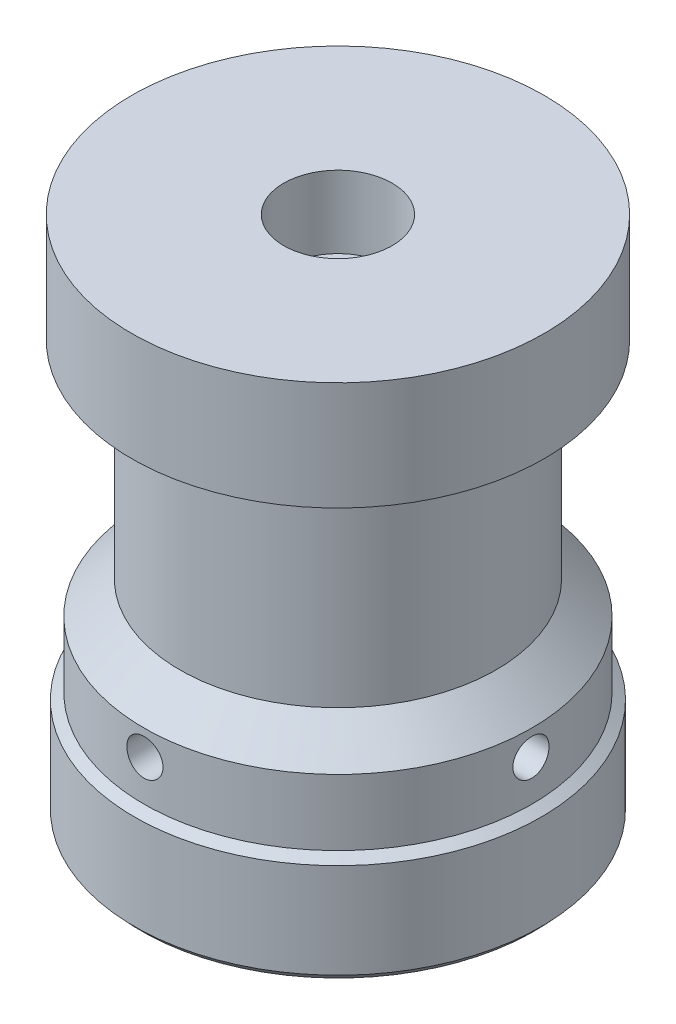
ISO-10303-21;
HEADER;
FILE_DESCRIPTION(('STEP AP214'),'2;1');
FILE_NAME('part.step','',(''),(''),'','','');
FILE_SCHEMA(('AUTOMOTIVE_DESIGN { 1 0 10303 214 1 1 1 1 }'));
ENDSEC;
DATA;
#1=APPLICATION_CONTEXT('core data for automotive mechanical design processes');
#2=APPLICATION_PROTOCOL_DEFINITION('international standard','automotive_design',2000,#1);
#3=PRODUCT_CONTEXT('',#1,'mechanical');
#4=PRODUCT('Part','Part','',(#3));
#5=PRODUCT_RELATED_PRODUCT_CATEGORY('part','',(#4));
#6=PRODUCT_DEFINITION_FORMATION('','',#4);
#7=PRODUCT_DEFINITION_CONTEXT('part definition',#1,'design');
#8=PRODUCT_DEFINITION('design','',#6,#7);
#9=PRODUCT_DEFINITION_SHAPE('','',#8);
#10=(LENGTH_UNIT() NAMED_UNIT(*) SI_UNIT(.MILLI.,.METRE.));
#11=(NAMED_UNIT(*) PLANE_ANGLE_UNIT() SI_UNIT($,.RADIAN.));
#12=(NAMED_UNIT(*) SI_UNIT($,.STERADIAN.) SOLID_ANGLE_UNIT());
#13=UNCERTAINTY_MEASURE_WITH_UNIT(LENGTH_MEASURE(1.E-05),#10,'distance_accuracy_value','');
#14=(GEOMETRIC_REPRESENTATION_CONTEXT(3) GLOBAL_UNCERTAINTY_ASSIGNED_CONTEXT((#13)) GLOBAL_UNIT_ASSIGNED_CONTEXT((#10,
#11,#12)) REPRESENTATION_CONTEXT('',''));
#15=CARTESIAN_POINT('',(0.,0.,0.));
#16=DIRECTION('',(0.,0.,1.));
#17=DIRECTION('',(1.,0.,0.));
#18=AXIS2_PLACEMENT_3D('',#15,#16,#17);
#19=CARTESIAN_POINT('',(21.75,0.,0.));
#20=DIRECTION('',(0.,-1.,0.));
#21=DIRECTION('',(0.,0.,-1.));
#22=AXIS2_PLACEMENT_3D('',#19,#20,#21);
#23=PLANE('',#22);
#24=DIRECTION('',(0.,0.,1.));
#25=VECTOR('',#24,1.);
#26=CARTESIAN_POINT('',(3.,0.,14.));
#27=LINE('',#26,#25);
#28=CARTESIAN_POINT('',(3.,0.,10.5830052442584));
#29=VERTEX_POINT('',#28);
#30=CARTESIAN_POINT('',(3.,0.,14.));
#31=VERTEX_POINT('',#30);
#32=EDGE_CURVE('E79',#29,#31,#27,.T.);
#33=ORIENTED_EDGE('',*,*,#32,.F.);
#34=CARTESIAN_POINT('',(0.,0.,0.));
#35=DIRECTION('',(0.,-1.,0.));
#36=DIRECTION('',(0.,0.,-1.));
#37=AXIS2_PLACEMENT_3D('',#34,#35,#36);
#38=CIRCLE('',#37,11.);
#39=CARTESIAN_POINT('',(-3.,0.,10.5830052442584));
#40=VERTEX_POINT('',#39);
#41=EDGE_CURVE('E11',#40,#29,#38,.T.);
#42=ORIENTED_EDGE('',*,*,#41,.F.);
#43=DIRECTION('',(0.,0.,-1.));
#44=VECTOR('',#43,1.);
#45=CARTESIAN_POINT('',(-3.,0.,14.));
#46=LINE('',#45,#44);
#47=CARTESIAN_POINT('',(-3.,0.,14.));
#48=VERTEX_POINT('',#47);
#49=EDGE_CURVE('E97',#48,#40,#46,.T.);
#50=ORIENTED_EDGE('',*,*,#49,.F.);
#51=DIRECTION('',(-1.,0.,0.));
#52=VECTOR('',#51,1.);
#53=CARTESIAN_POINT('',(-3.,0.,14.));
#54=LINE('',#53,#52);
#55=EDGE_CURVE('E86',#31,#48,#54,.T.);
#56=ORIENTED_EDGE('',*,*,#55,.F.);
#57=EDGE_LOOP('',(#33,#42,#50,#56));
#58=FACE_BOUND('',#57,.T.);
#59=CARTESIAN_POINT('',(0.,0.,0.));
#60=DIRECTION('',(0.,-1.,0.));
#61=DIRECTION('',(0.,0.,-1.));
#62=AXIS2_PLACEMENT_3D('',#59,#60,#61);
#63=CIRCLE('',#62,21.75);
#64=CARTESIAN_POINT('',(0.,0.,-21.75));
#65=VERTEX_POINT('',#64);
#66=EDGE_CURVE('E110',#65,#65,#63,.T.);
#67=ORIENTED_EDGE('',*,*,#66,.T.);
#68=EDGE_LOOP('',(#67));
#69=FACE_BOUND('',#68,.T.);
#70=ADVANCED_FACE('F33',(#58,#69),#23,.T.);
#71=CARTESIAN_POINT('',(0.,0.,0.));
#72=DIRECTION('',(0.,-1.,0.));
#73=DIRECTION('',(0.,0.,-1.));
#74=AXIS2_PLACEMENT_3D('',#71,#72,#73);
#75=CYLINDRICAL_SURFACE('',#74,11.);
#76=CARTESIAN_POINT('',(10.816653826392,16.5,-2.));
#77=CARTESIAN_POINT('',(10.8166559469823,16.388659877427,-1.99999566748834));
#78=CARTESIAN_POINT('',(10.818391586416,16.277262808712,-1.9906710042305));
#79=CARTESIAN_POINT('',(10.825138630904,16.057605384127,-1.953641319662));
#80=CARTESIAN_POINT('',(10.8301528833982,15.9493478403307,-1.92592032102069));
#81=CARTESIAN_POINT('',(10.8428709030557,15.7391796869815,-1.85297369289719));
#82=CARTESIAN_POINT('',(10.8505722376174,15.637263434692,-1.80776389192774));
#83=CARTESIAN_POINT('',(10.8677937983012,15.442470108371,-1.70116425408316));
#84=CARTESIAN_POINT('',(10.8773138647657,15.3495922419836,-1.6397758372698));
#85=CARTESIAN_POINT('',(10.8972247379328,15.1744165525582,-1.50179524823966));
#86=CARTESIAN_POINT('',(10.9076236306456,15.092239925766,-1.42505035347811));
#87=CARTESIAN_POINT('',(10.9280489317643,14.9418544371656,-1.25886539634162));
#88=CARTESIAN_POINT('',(10.9380753163763,14.8736464663546,-1.1694245247635));
#89=CARTESIAN_POINT('',(10.9567122399244,14.7526726815498,-0.979593418999867));
#90=CARTESIAN_POINT('',(10.965312146403,14.7000207300042,-0.879129490479887));
#91=CARTESIAN_POINT('',(10.9800367733651,14.6123866669739,-0.67059977443761));
#92=CARTESIAN_POINT('',(10.98616168519,14.5774031894906,-0.56253457532668));
#93=CARTESIAN_POINT('',(10.9951891058833,14.5264727667445,-0.343124837820859));
#94=CARTESIAN_POINT('',(10.9981261454525,14.5103216856793,-0.231829128518769));
#95=CARTESIAN_POINT('',(11.0005658088946,14.4968788325376,-0.00807147296592596));
#96=CARTESIAN_POINT('',(11.0000687084839,14.4995855464285,0.104390378935037));
#97=CARTESIAN_POINT('',(10.9957231855211,14.5236241420779,0.325889196140739));
#98=CARTESIAN_POINT('',(10.9919143087691,14.5447362535144,0.434950900053348));
#99=CARTESIAN_POINT('',(10.9814174690798,14.6046391974615,0.647957490603365));
#100=CARTESIAN_POINT('',(10.974729405919,14.6434306453862,0.751902198979602));
#101=CARTESIAN_POINT('',(10.9591592037236,14.7378030597792,0.952366225453846));
#102=CARTESIAN_POINT('',(10.9502655302338,14.7934726440338,1.04884289251746));
#103=CARTESIAN_POINT('',(10.9312689682172,14.9199558899247,1.23116763357293));
#104=CARTESIAN_POINT('',(10.9211659638428,14.9907710029355,1.31701468769822));
#105=CARTESIAN_POINT('',(10.9006990809284,15.1467484545793,1.47694445054394));
#106=CARTESIAN_POINT('',(10.8903335415211,15.232103017919,1.55083959404949));
#107=CARTESIAN_POINT('',(10.8706496206858,15.4140940639209,1.68329271964166));
#108=CARTESIAN_POINT('',(10.861331252829,15.5107306927653,1.74185050296967));
#109=CARTESIAN_POINT('',(10.8447947340983,15.7127825104868,1.84201538249093));
#110=CARTESIAN_POINT('',(10.8375798001274,15.8182108316398,1.88359655385222));
#111=CARTESIAN_POINT('',(10.8261173347694,16.0347174498884,1.94840376886998));
#112=CARTESIAN_POINT('',(10.8218694887144,16.1457951465111,1.97163175896676));
#113=CARTESIAN_POINT('',(10.8168840409274,16.3687598012054,1.99880217851546));
#114=CARTESIAN_POINT('',(10.8160975038278,16.4806129326696,2.00301348489165));
#115=CARTESIAN_POINT('',(10.8179929515389,16.7034245505611,1.9927505477885));
#116=CARTESIAN_POINT('',(10.8206747755886,16.814383078214,1.97827717035789));
#117=CARTESIAN_POINT('',(10.8291592937867,17.0313803440523,1.93128609638897));
#118=CARTESIAN_POINT('',(10.8349378000789,17.137450384008,1.89890818855376));
#119=CARTESIAN_POINT('',(10.8489439080076,17.3426597188284,1.81717497571878));
#120=CARTESIAN_POINT('',(10.8571716806773,17.4417985290857,1.76781848506108));
#121=CARTESIAN_POINT('',(10.8752613415266,17.6315191960152,1.65290586187994));
#122=CARTESIAN_POINT('',(10.8851400484298,17.7219961180844,1.58717917941567));
#123=CARTESIAN_POINT('',(10.9053706629202,17.8907336915978,1.44162304950736));
#124=CARTESIAN_POINT('',(10.91572261035,17.9689933119997,1.36179241301325));
#125=CARTESIAN_POINT('',(10.9358898604531,18.1120728461498,1.18909630007261));
#126=CARTESIAN_POINT('',(10.9456968282676,18.1767123553618,1.09608023252377));
#127=CARTESIAN_POINT('',(10.9635308137777,18.289446306083,0.900352619793531));
#128=CARTESIAN_POINT('',(10.9715578970606,18.3375413572772,0.797641432067851));
#129=CARTESIAN_POINT('',(10.9848917263157,18.4155480386364,0.585948218345346));
#130=CARTESIAN_POINT('',(10.9902119510479,18.4455499048765,0.477000329353954));
#131=CARTESIAN_POINT('',(10.9975899747809,18.4868073432972,0.255506648963483));
#132=CARTESIAN_POINT('',(10.9996480956777,18.4980647651367,0.142961213679234));
#133=CARTESIAN_POINT('',(11.0002641421388,18.5014525211055,-0.0807996190288145));
#134=CARTESIAN_POINT('',(10.9988720323112,18.4938558884847,-0.192010837925445));
#135=CARTESIAN_POINT('',(10.9928473390214,18.4603470535761,-0.411544538990864));
#136=CARTESIAN_POINT('',(10.9882147827193,18.434435004801,-0.519867045363826));
#137=CARTESIAN_POINT('',(10.9762290690773,18.3651430965107,-0.730415433440431));
#138=CARTESIAN_POINT('',(10.96888018348,18.3217906546244,-0.832650596646199));
#139=CARTESIAN_POINT('',(10.9522592239203,18.2188805971912,-1.02843701194217));
#140=CARTESIAN_POINT('',(10.9429870315355,18.1593219837226,-1.12198772879735));
#141=CARTESIAN_POINT('',(10.9233859020729,18.0247423614381,-1.29911459753549));
#142=CARTESIAN_POINT('',(10.9130443794735,17.9495233046157,-1.38253889858448));
#143=CARTESIAN_POINT('',(10.8925517029222,17.7861704833065,-1.53567622355086));
#144=CARTESIAN_POINT('',(10.8824005942262,17.6980336914384,-1.60538602436339));
#145=CARTESIAN_POINT('',(10.8633428283932,17.5104403243989,-1.72967671803608));
#146=CARTESIAN_POINT('',(10.8544476470463,17.4108927606887,-1.78412208501856));
#147=CARTESIAN_POINT('',(10.8390461745677,17.203936723274,-1.87543058906983));
#148=CARTESIAN_POINT('',(10.8325375922296,17.0965359083922,-1.9123105996278));
#149=CARTESIAN_POINT('',(10.8240281075057,16.9073233155677,-1.95979896205519));
#150=CARTESIAN_POINT('',(10.821278872104,16.8266307373914,-1.97484899189766));
#151=CARTESIAN_POINT('',(10.8175909727573,16.6639690479678,-1.99495098425024));
#152=CARTESIAN_POINT('',(10.8166522646159,16.5819999679303,-2.00000319081575));
#153=CARTESIAN_POINT('',(10.816653826392,16.5,-2.));
#154=B_SPLINE_CURVE_WITH_KNOTS('',3,(#76,#77,#78,#79,#80,#81,#82,#83,#84,#85,#86,#87,#88,#89,
#90,#91,#92,#93,#94,#95,#96,#97,#98,#99,#100,#101,#102,#103,#104,#105,#106,#107,#108,#109,#110,
#111,#112,#113,#114,#115,#116,#117,#118,#119,#120,#121,#122,#123,#124,#125,#126,#127,#128,#129,
#130,#131,#132,#133,#134,#135,#136,#137,#138,#139,#140,#141,#142,#143,#144,#145,#146,#147,#148,
#149,#150,#151,#152,#153),.UNSPECIFIED.,.T.,.F.,(4,2,2,2,2,2,2,2,2,2,2,2,2,2,2,2,2,2,2,2,2,2,2,
2,2,2,2,2,2,2,2,2,2,2,2,2,2,2,4),(0.,0.333720352628774,0.667730923425362,1.00143989738151,
1.33511959011685,1.6722993511526,2.00950061266478,2.34911212511978,2.6886973772514,
3.02456639415963,3.3604084455173,3.69229445292967,4.02419201411038,4.3578632848798,
4.69156654523441,5.03008350848145,5.36860485839155,5.70764124486732,6.04664167012788,
6.3808336464698,6.71501013332593,7.04661365662176,7.37824034134339,7.71347820234125,
8.04874433945132,8.38820522569594,8.72765360102077,9.06539473675368,9.40310254298626,
9.73594847886932,10.0687916249998,10.4011135484041,10.7334559397116,11.0702887970716,
11.4072007206838,11.7470154829573,12.0865031534681,12.3322881015162,12.5780670496697),.UNSPECIFIED.);
#155=CARTESIAN_POINT('',(10.816653826392,16.5,-2.));
#156=VERTEX_POINT('',#155);
#157=EDGE_CURVE('E151',#156,#156,#154,.T.);
#158=ORIENTED_EDGE('',*,*,#157,.F.);
#159=EDGE_LOOP('',(#158));
#160=FACE_BOUND('',#159,.T.);
#161=DIRECTION('',(0.,-1.,0.));
#162=VECTOR('',#161,1.);
#163=CARTESIAN_POINT('',(3.,0.,10.5830052442584));
#164=LINE('',#163,#162);
#165=CARTESIAN_POINT('',(3.,41.4,10.5830052442584));
#166=VERTEX_POINT('',#165);
#167=EDGE_CURVE('E62',#166,#29,#164,.T.);
#168=ORIENTED_EDGE('',*,*,#167,.F.);
#169=CARTESIAN_POINT('',(0.,41.4,0.));
#170=DIRECTION('',(0.,-1.,0.));
#171=DIRECTION('',(0.,0.,-1.));
#172=AXIS2_PLACEMENT_3D('',#169,#170,#171);
#173=CIRCLE('',#172,11.);
#174=CARTESIAN_POINT('',(-3.,41.4,10.5830052442584));
#175=VERTEX_POINT('',#174);
#176=EDGE_CURVE('E46',#175,#166,#173,.T.);
#177=ORIENTED_EDGE('',*,*,#176,.F.);
#178=DIRECTION('',(0.,-1.,0.));
#179=VECTOR('',#178,1.);
#180=CARTESIAN_POINT('',(-3.,0.,10.5830052442584));
#181=LINE('',#180,#179);
#182=EDGE_CURVE('E106',#40,#175,#181,.F.);
#183=ORIENTED_EDGE('',*,*,#182,.F.);
#184=ORIENTED_EDGE('',*,*,#41,.T.);
#185=EDGE_LOOP('',(#168,#177,#183,#184));
#186=FACE_BOUND('',#185,.T.);
#187=ADVANCED_FACE('F169',(#160,#186),#75,.F.);
#188=CARTESIAN_POINT('',(11.,41.4,0.));
#189=DIRECTION('',(0.,-1.,0.));
#190=DIRECTION('',(0.,0.,-1.));
#191=AXIS2_PLACEMENT_3D('',#188,#189,#190);
#192=PLANE('',#191);
#193=ORIENTED_EDGE('',*,*,#176,.T.);
#194=DIRECTION('',(0.,0.,-1.));
#195=VECTOR('',#194,1.);
#196=CARTESIAN_POINT('',(3.,41.4,14.));
#197=LINE('',#196,#195);
#198=CARTESIAN_POINT('',(3.,41.4,14.));
#199=VERTEX_POINT('',#198);
#200=EDGE_CURVE('E107',#199,#166,#197,.T.);
#201=ORIENTED_EDGE('',*,*,#200,.F.);
#202=DIRECTION('',(1.,0.,0.));
#203=VECTOR('',#202,1.);
#204=CARTESIAN_POINT('',(-3.,41.4,14.));
#205=LINE('',#204,#203);
#206=CARTESIAN_POINT('',(-3.,41.4,14.));
#207=VERTEX_POINT('',#206);
#208=EDGE_CURVE('E94',#207,#199,#205,.T.);
#209=ORIENTED_EDGE('',*,*,#208,.F.);
#210=DIRECTION('',(0.,0.,1.));
#211=VECTOR('',#210,1.);
#212=CARTESIAN_POINT('',(-3.,41.4,14.));
#213=LINE('',#212,#211);
#214=EDGE_CURVE('E54',#175,#207,#213,.T.);
#215=ORIENTED_EDGE('',*,*,#214,.F.);
#216=EDGE_LOOP('',(#193,#201,#209,#215));
#217=FACE_BOUND('',#216,.T.);
#218=CARTESIAN_POINT('',(0.,41.4,0.));
#219=DIRECTION('',(0.,-1.,0.));
#220=DIRECTION('',(0.,0.,-1.));
#221=AXIS2_PLACEMENT_3D('',#218,#219,#220);
#222=CIRCLE('',#221,3.25);
#223=CARTESIAN_POINT('',(0.,41.4,-3.25));
#224=VERTEX_POINT('',#223);
#225=EDGE_CURVE('E146',#224,#224,#222,.T.);
#226=ORIENTED_EDGE('',*,*,#225,.F.);
#227=EDGE_LOOP('',(#226));
#228=FACE_BOUND('',#227,.T.);
#229=ADVANCED_FACE('F236',(#217,#228),#192,.T.);
#230=CARTESIAN_POINT('',(0.,0.,0.));
#231=DIRECTION('',(0.,-1.,0.));
#232=DIRECTION('',(0.,0.,-1.));
#233=AXIS2_PLACEMENT_3D('',#230,#231,#232);
#234=CYLINDRICAL_SURFACE('',#233,3.25);
#235=ORIENTED_EDGE('',*,*,#225,.T.);
#236=EDGE_LOOP('',(#235));
#237=FACE_BOUND('',#236,.T.);
#238=CARTESIAN_POINT('',(0.,49.8,0.));
#239=DIRECTION('',(0.,-1.,0.));
#240=DIRECTION('',(0.,0.,-1.));
#241=AXIS2_PLACEMENT_3D('',#238,#239,#240);
#242=CIRCLE('',#241,3.25);
#243=CARTESIAN_POINT('',(0.,49.8,-3.25));
#244=VERTEX_POINT('',#243);
#245=EDGE_CURVE('E143',#244,#244,#242,.T.);
#246=ORIENTED_EDGE('',*,*,#245,.F.);
#247=EDGE_LOOP('',(#246));
#248=FACE_BOUND('',#247,.T.);
#249=ADVANCED_FACE('F233',(#237,#248),#234,.F.);
#250=CARTESIAN_POINT('',(3.25,49.8,0.));
#251=DIRECTION('',(0.,1.,0.));
#252=DIRECTION('',(0.,0.,1.));
#253=AXIS2_PLACEMENT_3D('',#250,#251,#252);
#254=PLANE('',#253);
#255=ORIENTED_EDGE('',*,*,#245,.T.);
#256=EDGE_LOOP('',(#255));
#257=FACE_BOUND('',#256,.T.);
#258=CARTESIAN_POINT('',(0.,49.8,0.));
#259=DIRECTION('',(0.,-1.,0.));
#260=DIRECTION('',(0.,0.,-1.));
#261=AXIS2_PLACEMENT_3D('',#258,#259,#260);
#262=CIRCLE('',#261,6.);
#263=CARTESIAN_POINT('',(0.,49.8,-6.));
#264=VERTEX_POINT('',#263);
#265=EDGE_CURVE('E140',#264,#264,#262,.T.);
#266=ORIENTED_EDGE('',*,*,#265,.F.);
#267=EDGE_LOOP('',(#266));
#268=FACE_BOUND('',#267,.T.);
#269=ADVANCED_FACE('F229',(#257,#268),#254,.T.);
#270=CARTESIAN_POINT('',(0.,0.,0.));
#271=DIRECTION('',(0.,-1.,0.));
#272=DIRECTION('',(0.,0.,-1.));
#273=AXIS2_PLACEMENT_3D('',#270,#271,#272);
#274=CYLINDRICAL_SURFACE('',#273,6.);
#275=ORIENTED_EDGE('',*,*,#265,.T.);
#276=EDGE_LOOP('',(#275));
#277=FACE_BOUND('',#276,.T.);
#278=CARTESIAN_POINT('',(0.,57.8,0.));
#279=DIRECTION('',(0.,-1.,0.));
#280=DIRECTION('',(0.,0.,-1.));
#281=AXIS2_PLACEMENT_3D('',#278,#279,#280);
#282=CIRCLE('',#281,6.);
#283=CARTESIAN_POINT('',(0.,57.8,-6.));
#284=VERTEX_POINT('',#283);
#285=EDGE_CURVE('E137',#284,#284,#282,.T.);
#286=ORIENTED_EDGE('',*,*,#285,.F.);
#287=EDGE_LOOP('',(#286));
#288=FACE_BOUND('',#287,.T.);
#289=ADVANCED_FACE('F225',(#277,#288),#274,.F.);
#290=CARTESIAN_POINT('',(6.,57.8,0.));
#291=DIRECTION('',(0.,1.,0.));
#292=DIRECTION('',(0.,0.,1.));
#293=AXIS2_PLACEMENT_3D('',#290,#291,#292);
#294=PLANE('',#293);
#295=ORIENTED_EDGE('',*,*,#285,.T.);
#296=EDGE_LOOP('',(#295));
#297=FACE_BOUND('',#296,.T.);
#298=CARTESIAN_POINT('',(0.,57.8,0.));
#299=DIRECTION('',(0.,-1.,0.));
#300=DIRECTION('',(0.,0.,-1.));
#301=AXIS2_PLACEMENT_3D('',#298,#299,#300);
#302=CIRCLE('',#301,22.825);
#303=CARTESIAN_POINT('',(0.,57.8,-22.825));
#304=VERTEX_POINT('',#303);
#305=EDGE_CURVE('E134',#304,#304,#302,.T.);
#306=ORIENTED_EDGE('',*,*,#305,.F.);
#307=EDGE_LOOP('',(#306));
#308=FACE_BOUND('',#307,.T.);
#309=ADVANCED_FACE('F221',(#297,#308),#294,.T.);
#310=CARTESIAN_POINT('',(0.,0.,0.));
#311=DIRECTION('',(0.,-1.,0.));
#312=DIRECTION('',(0.,0.,-1.));
#313=AXIS2_PLACEMENT_3D('',#310,#311,#312);
#314=CYLINDRICAL_SURFACE('',#313,22.825);
#315=ORIENTED_EDGE('',*,*,#305,.T.);
#316=EDGE_LOOP('',(#315));
#317=FACE_BOUND('',#316,.T.);
#318=CARTESIAN_POINT('',(0.,45.8,0.));
#319=DIRECTION('',(0.,-1.,0.));
#320=DIRECTION('',(0.,0.,-1.));
#321=AXIS2_PLACEMENT_3D('',#318,#319,#320);
#322=CIRCLE('',#321,22.825);
#323=CARTESIAN_POINT('',(0.,45.8,-22.825));
#324=VERTEX_POINT('',#323);
#325=EDGE_CURVE('E131',#324,#324,#322,.T.);
#326=ORIENTED_EDGE('',*,*,#325,.F.);
#327=EDGE_LOOP('',(#326));
#328=FACE_BOUND('',#327,.T.);
#329=ADVANCED_FACE('F217',(#317,#328),#314,.T.);
#330=CARTESIAN_POINT('',(22.825,45.8,0.));
#331=DIRECTION('',(0.,-1.,0.));
#332=DIRECTION('',(0.,0.,-1.));
#333=AXIS2_PLACEMENT_3D('',#330,#331,#332);
#334=PLANE('',#333);
#335=ORIENTED_EDGE('',*,*,#325,.T.);
#336=EDGE_LOOP('',(#335));
#337=FACE_BOUND('',#336,.T.);
#338=CARTESIAN_POINT('',(0.,45.8,0.));
#339=DIRECTION('',(0.,-1.,0.));
#340=DIRECTION('',(0.,0.,-1.));
#341=AXIS2_PLACEMENT_3D('',#338,#339,#340);
#342=CIRCLE('',#341,17.5);
#343=CARTESIAN_POINT('',(0.,45.8,-17.5));
#344=VERTEX_POINT('',#343);
#345=EDGE_CURVE('E128',#344,#344,#342,.T.);
#346=ORIENTED_EDGE('',*,*,#345,.F.);
#347=EDGE_LOOP('',(#346));
#348=FACE_BOUND('',#347,.T.);
#349=ADVANCED_FACE('F213',(#337,#348),#334,.T.);
#350=CARTESIAN_POINT('',(0.,0.,0.));
#351=DIRECTION('',(0.,-1.,0.));
#352=DIRECTION('',(0.,0.,-1.));
#353=AXIS2_PLACEMENT_3D('',#350,#351,#352);
#354=CYLINDRICAL_SURFACE('',#353,17.5);
#355=ORIENTED_EDGE('',*,*,#345,.T.);
#356=EDGE_LOOP('',(#355));
#357=FACE_BOUND('',#356,.T.);
#358=CARTESIAN_POINT('',(0.,22.9,0.));
#359=DIRECTION('',(0.,-1.,0.));
#360=DIRECTION('',(0.,0.,-1.));
#361=AXIS2_PLACEMENT_3D('',#358,#359,#360);
#362=CIRCLE('',#361,17.5);
#363=CARTESIAN_POINT('',(0.,22.9,-17.5));
#364=VERTEX_POINT('',#363);
#365=EDGE_CURVE('E125',#364,#364,#362,.T.);
#366=ORIENTED_EDGE('',*,*,#365,.F.);
#367=EDGE_LOOP('',(#366));
#368=FACE_BOUND('',#367,.T.);
#369=ADVANCED_FACE('F209',(#357,#368),#354,.T.);
#370=CARTESIAN_POINT('',(0.,19.3,0.));
#371=DIRECTION('',(0.,-1.,0.));
#372=DIRECTION('',(0.,0.,-1.));
#373=AXIS2_PLACEMENT_3D('',#370,#371,#372);
#374=CONICAL_SURFACE('',#373,21.45,0.831722614098055);
#375=ORIENTED_EDGE('',*,*,#365,.T.);
#376=EDGE_LOOP('',(#375));
#377=FACE_BOUND('',#376,.T.);
#378=CARTESIAN_POINT('',(0.,19.3,0.));
#379=DIRECTION('',(0.,-1.,0.));
#380=DIRECTION('',(0.,0.,-1.));
#381=AXIS2_PLACEMENT_3D('',#378,#379,#380);
#382=CIRCLE('',#381,21.45);
#383=CARTESIAN_POINT('',(0.,19.3,-21.45));
#384=VERTEX_POINT('',#383);
#385=EDGE_CURVE('E122',#384,#384,#382,.T.);
#386=ORIENTED_EDGE('',*,*,#385,.F.);
#387=EDGE_LOOP('',(#386));
#388=FACE_BOUND('',#387,.T.);
#389=ADVANCED_FACE('F204',(#377,#388),#374,.T.);
#390=CARTESIAN_POINT('',(0.,0.,0.));
#391=DIRECTION('',(0.,-1.,0.));
#392=DIRECTION('',(0.,0.,-1.));
#393=AXIS2_PLACEMENT_3D('',#390,#391,#392);
#394=CYLINDRICAL_SURFACE('',#393,21.45);
#395=CARTESIAN_POINT('',(21.3565563703515,16.5,-2.));
#396=CARTESIAN_POINT('',(21.3565576008238,16.6120785925965,-1.99999512685014));
#397=CARTESIAN_POINT('',(21.3574481523496,16.7242322305484,-1.99054707678393));
#398=CARTESIAN_POINT('',(21.3609138387139,16.94543272501,-1.9529981419504));
#399=CARTESIAN_POINT('',(21.3634908523418,17.0544759748616,-1.92487645345485));
#400=CARTESIAN_POINT('',(21.3700350766556,17.2662201768466,-1.85080384088652));
#401=CARTESIAN_POINT('',(21.3740014677801,17.368924826056,-1.80486342595429));
#402=CARTESIAN_POINT('',(21.3828765192063,17.5651421805717,-1.69647700499459));
#403=CARTESIAN_POINT('',(21.3877849862045,17.6586567656352,-1.63403438404701));
#404=CARTESIAN_POINT('',(21.3980086246757,17.8341599246252,-1.49420234686204));
#405=CARTESIAN_POINT('',(21.4033249056076,17.9161152010812,-1.4167712161432));
#406=CARTESIAN_POINT('',(21.4137550553655,18.0658868738461,-1.24924896854826));
#407=CARTESIAN_POINT('',(21.4188689151022,18.1337026358452,-1.15915728401309));
#408=CARTESIAN_POINT('',(21.4283288217724,18.253383717224,-0.968669324641614));
#409=CARTESIAN_POINT('',(21.4326734558483,18.3052198130784,-0.868254612911983));
#410=CARTESIAN_POINT('',(21.4400933600159,18.391283189011,-0.660099258275137));
#411=CARTESIAN_POINT('',(21.4431686573141,18.4255108465071,-0.552358772444039));
#412=CARTESIAN_POINT('',(21.4476956105015,18.4752887650145,-0.332944847610839));
#413=CARTESIAN_POINT('',(21.4491519938173,18.4908934173523,-0.221283847319984));
#414=CARTESIAN_POINT('',(21.4502930794614,18.503150597816,0.00308117794537669));
#415=CARTESIAN_POINT('',(21.4499778221797,18.4998035580043,0.115785179082974));
#416=CARTESIAN_POINT('',(21.447615029732,18.4742966564391,0.338667903301007));
#417=CARTESIAN_POINT('',(21.4455728801654,18.452195282438,0.448853384826017));
#418=CARTESIAN_POINT('',(21.4399920782927,18.3898981318961,0.66394407901939));
#419=CARTESIAN_POINT('',(21.4364534087438,18.3497021468701,0.768849230832567));
#420=CARTESIAN_POINT('',(21.4282682557908,18.2522922101992,0.970586505811963));
#421=CARTESIAN_POINT('',(21.423620081058,18.1950522434322,1.06740599603252));
#422=CARTESIAN_POINT('',(21.4137378215442,18.0651980643569,1.25008573655175));
#423=CARTESIAN_POINT('',(21.4085037218435,17.9925834605128,1.33594570766225));
#424=CARTESIAN_POINT('',(21.3980138453541,17.8337120312159,1.49461147638494));
#425=CARTESIAN_POINT('',(21.3927580618601,17.7474043509545,1.56736636243229));
#426=CARTESIAN_POINT('',(21.3828371153145,17.5637734331619,1.6973629142777));
#427=CARTESIAN_POINT('',(21.378171952947,17.466450182871,1.75460456210595));
#428=CARTESIAN_POINT('',(21.3699598534864,17.2635130930932,1.85194878756623));
#429=CARTESIAN_POINT('',(21.3664131075851,17.1578978399495,1.8920484352122));
#430=CARTESIAN_POINT('',(21.3608433063137,16.9413931311556,1.95393120083469));
#431=CARTESIAN_POINT('',(21.3588202106985,16.8305038148949,1.97571480260661));
#432=CARTESIAN_POINT('',(21.3565335723438,16.6070450491096,2.0002820748038));
#433=CARTESIAN_POINT('',(21.3562634426775,16.4944834840326,2.00313687279002));
#434=CARTESIAN_POINT('',(21.3574959392978,16.2704835004828,1.98995209211393));
#435=CARTESIAN_POINT('',(21.3589985448105,16.159045068864,1.97391273486378));
#436=CARTESIAN_POINT('',(21.3636012093167,15.9406606669782,1.92345436068486));
#437=CARTESIAN_POINT('',(21.3666983611511,15.8337069027769,1.88906878824265));
#438=CARTESIAN_POINT('',(21.374138769837,15.6270859500077,1.80292814539459));
#439=CARTESIAN_POINT('',(21.3784820516008,15.5274189071643,1.75117272773101));
#440=CARTESIAN_POINT('',(21.3879413014324,15.3378758274189,1.63158259007023));
#441=CARTESIAN_POINT('',(21.3930595235758,15.2480297143312,1.56370062367424));
#442=CARTESIAN_POINT('',(21.4034844830418,15.0809819101881,1.41385224706862));
#443=CARTESIAN_POINT('',(21.4087912244192,15.003780491311,1.33188553376108));
#444=CARTESIAN_POINT('',(21.4190150593086,14.8639693249333,1.15588634200927));
#445=CARTESIAN_POINT('',(21.4239308842483,14.8014058982055,1.06181698312418));
#446=CARTESIAN_POINT('',(21.4328006209716,14.6929650133188,0.864465626994149));
#447=CARTESIAN_POINT('',(21.4367545444265,14.6470873527015,0.761183741549338));
#448=CARTESIAN_POINT('',(21.4432492058058,14.5733992401998,0.548502647496584));
#449=CARTESIAN_POINT('',(21.445792153399,14.5455605267519,0.439113300946836));
#450=CARTESIAN_POINT('',(21.4491873703692,14.5086482542855,0.217188197139773));
#451=CARTESIAN_POINT('',(21.450039680622,14.4995742415772,0.10465251602069));
#452=CARTESIAN_POINT('',(21.4499576063941,14.5004548545958,-0.119915125435681));
#453=CARTESIAN_POINT('',(21.4490299848796,14.5103374534001,-0.231947377687086));
#454=CARTESIAN_POINT('',(21.4455056248234,14.5487000789363,-0.452753161576243));
#455=CARTESIAN_POINT('',(21.442908884528,14.5771801252058,-0.561526689790388));
#456=CARTESIAN_POINT('',(21.4363373987382,14.6519099285239,-0.772728974295921));
#457=CARTESIAN_POINT('',(21.4323627905415,14.6981579151341,-0.875158361551666));
#458=CARTESIAN_POINT('',(21.4234793064303,14.8071029193697,-1.07081136204175));
#459=CARTESIAN_POINT('',(21.4185704399361,14.8697997711407,-1.16403506808417));
#460=CARTESIAN_POINT('',(21.4083465436239,15.0101331971869,-1.33899946763048));
#461=CARTESIAN_POINT('',(21.4030301007618,15.0878233076621,-1.42069713928038));
#462=CARTESIAN_POINT('',(21.3926022639105,15.2558353206015,-1.56992997165634));
#463=CARTESIAN_POINT('',(21.3874909196216,15.3461602612897,-1.63746171619262));
#464=CARTESIAN_POINT('',(21.3780396224544,15.5370963532217,-1.75656207955579));
#465=CARTESIAN_POINT('',(21.3737014334764,15.637730220936,-1.80809439045743));
#466=CARTESIAN_POINT('',(21.3663088306675,15.8461967723574,-1.89346240171872));
#467=CARTESIAN_POINT('',(21.3632529576429,15.9540211108868,-1.92731822756812));
#468=CARTESIAN_POINT('',(21.359548177367,16.1353892642269,-1.96785242703185));
#469=CARTESIAN_POINT('',(21.3584314917356,16.2077704790911,-1.97989148498287));
#470=CARTESIAN_POINT('',(21.3569351871364,16.3534237639724,-1.99596685098432));
#471=CARTESIAN_POINT('',(21.3565555655702,16.4266958308479,-2.00000318724739));
#472=CARTESIAN_POINT('',(21.3565563703515,16.5,-2.));
#473=B_SPLINE_CURVE_WITH_KNOTS('',3,(#395,#396,#397,#398,#399,#400,#401,#402,#403,#404,#405,
#406,#407,#408,#409,#410,#411,#412,#413,#414,#415,#416,#417,#418,#419,#420,#421,#422,#423,#424,
#425,#426,#427,#428,#429,#430,#431,#432,#433,#434,#435,#436,#437,#438,#439,#440,#441,#442,#443,
#444,#445,#446,#447,#448,#449,#450,#451,#452,#453,#454,#455,#456,#457,#458,#459,#460,#461,#462,
#463,#464,#465,#466,#467,#468,#469,#470,#471,#472),.UNSPECIFIED.,.T.,.F.,(4,2,2,2,2,2,2,2,2,2,2,
2,2,2,2,2,2,2,2,2,2,2,2,2,2,2,2,2,2,2,2,2,2,2,2,2,2,2,4),(0.,0.335968104179995,
0.672311129502985,1.00845608710659,1.34453214510252,1.68155734429175,2.01859765944572,
2.3562507447131,2.693896592449,3.03055386157517,3.36720345559014,3.70280700774438,
4.03841442680528,4.3745367500619,4.71066763415558,5.04807743132695,5.38548761933601,
5.7229554559412,6.06041437847622,6.39660453094161,6.73279074378405,7.06836618484249,
7.40394833512065,7.74052604521854,8.07711099923618,8.41474706402462,8.75237903193275,
9.08948074566582,9.42657430891411,9.76238959908804,10.0982052420562,10.4339874322563,
10.7697662368862,11.106766959171,11.4438488578053,11.7816902063356,12.1191460635491,
12.3388842757363,12.5586217132611),.UNSPECIFIED.);
#474=CARTESIAN_POINT('',(21.3565563703515,16.5,-2.));
#475=VERTEX_POINT('',#474);
#476=EDGE_CURVE('E36',#475,#475,#473,.T.);
#477=ORIENTED_EDGE('',*,*,#476,.F.);
#478=EDGE_LOOP('',(#477));
#479=FACE_BOUND('',#478,.T.);
#480=CARTESIAN_POINT('',(2.,16.5,21.3565563703515));
#481=CARTESIAN_POINT('',(1.99999512685014,16.6120785925965,21.3565576008238));
#482=CARTESIAN_POINT('',(1.99054707678393,16.7242322305484,21.3574481523496));
#483=CARTESIAN_POINT('',(1.9529981419504,16.94543272501,21.3609138387139));
#484=CARTESIAN_POINT('',(1.92487645345485,17.0544759748616,21.3634908523418));
#485=CARTESIAN_POINT('',(1.85080384088652,17.2662201768466,21.3700350766556));
#486=CARTESIAN_POINT('',(1.80486342595429,17.368924826056,21.3740014677801));
#487=CARTESIAN_POINT('',(1.69647700499459,17.5651421805717,21.3828765192063));
#488=CARTESIAN_POINT('',(1.634034384047,17.6586567656352,21.3877849862045));
#489=CARTESIAN_POINT('',(1.49420234686204,17.8341599246252,21.3980086246757));
#490=CARTESIAN_POINT('',(1.4167712161432,17.9161152010812,21.4033249056076));
#491=CARTESIAN_POINT('',(1.24924896854826,18.0658868738461,21.4137550553655));
#492=CARTESIAN_POINT('',(1.15915728401309,18.1337026358452,21.4188689151022));
#493=CARTESIAN_POINT('',(0.968669324641614,18.253383717224,21.4283288217724));
#494=CARTESIAN_POINT('',(0.868254612911983,18.3052198130784,21.4326734558483));
#495=CARTESIAN_POINT('',(0.660099258275137,18.391283189011,21.4400933600159));
#496=CARTESIAN_POINT('',(0.552358772444039,18.4255108465071,21.4431686573141));
#497=CARTESIAN_POINT('',(0.332944847610839,18.4752887650145,21.4476956105015));
#498=CARTESIAN_POINT('',(0.221283847319985,18.4908934173523,21.4491519938173));
#499=CARTESIAN_POINT('',(-0.00308117794537661,18.503150597816,21.4502930794614));
#500=CARTESIAN_POINT('',(-0.115785179082974,18.4998035580043,21.4499778221797));
#501=CARTESIAN_POINT('',(-0.338667903301007,18.4742966564391,21.447615029732));
#502=CARTESIAN_POINT('',(-0.448853384826017,18.452195282438,21.4455728801654));
#503=CARTESIAN_POINT('',(-0.66394407901939,18.3898981318961,21.4399920782927));
#504=CARTESIAN_POINT('',(-0.768849230832567,18.3497021468701,21.4364534087438));
#505=CARTESIAN_POINT('',(-0.970586505811963,18.2522922101992,21.4282682557908));
#506=CARTESIAN_POINT('',(-1.06740599603252,18.1950522434322,21.423620081058));
#507=CARTESIAN_POINT('',(-1.25008573655175,18.0651980643569,21.4137378215442));
#508=CARTESIAN_POINT('',(-1.33594570766225,17.9925834605128,21.4085037218435));
#509=CARTESIAN_POINT('',(-1.49461147638494,17.8337120312159,21.3980138453541));
#510=CARTESIAN_POINT('',(-1.56736636243229,17.7474043509545,21.3927580618601));
#511=CARTESIAN_POINT('',(-1.6973629142777,17.5637734331619,21.3828371153145));
#512=CARTESIAN_POINT('',(-1.75460456210595,17.466450182871,21.378171952947));
#513=CARTESIAN_POINT('',(-1.85194878756623,17.2635130930932,21.3699598534864));
#514=CARTESIAN_POINT('',(-1.8920484352122,17.1578978399495,21.3664131075851));
#515=CARTESIAN_POINT('',(-1.95393120083469,16.9413931311556,21.3608433063137));
#516=CARTESIAN_POINT('',(-1.97571480260661,16.8305038148949,21.3588202106985));
#517=CARTESIAN_POINT('',(-2.0002820748038,16.6070450491096,21.3565335723438));
#518=CARTESIAN_POINT('',(-2.00313687279002,16.4944834840326,21.3562634426775));
#519=CARTESIAN_POINT('',(-1.98995209211393,16.2704835004828,21.3574959392978));
#520=CARTESIAN_POINT('',(-1.97391273486378,16.159045068864,21.3589985448105));
#521=CARTESIAN_POINT('',(-1.92345436068486,15.9406606669782,21.3636012093168));
#522=CARTESIAN_POINT('',(-1.88906878824265,15.8337069027769,21.3666983611511));
#523=CARTESIAN_POINT('',(-1.80292814539459,15.6270859500077,21.374138769837));
#524=CARTESIAN_POINT('',(-1.75117272773101,15.5274189071643,21.3784820516008));
#525=CARTESIAN_POINT('',(-1.63158259007023,15.3378758274189,21.3879413014324));
#526=CARTESIAN_POINT('',(-1.56370062367424,15.2480297143312,21.3930595235758));
#527=CARTESIAN_POINT('',(-1.41385224706862,15.0809819101881,21.4034844830418));
#528=CARTESIAN_POINT('',(-1.33188553376108,15.003780491311,21.4087912244192));
#529=CARTESIAN_POINT('',(-1.15588634200927,14.8639693249333,21.4190150593086));
#530=CARTESIAN_POINT('',(-1.06181698312418,14.8014058982055,21.4239308842483));
#531=CARTESIAN_POINT('',(-0.86446562699415,14.6929650133188,21.4328006209716));
#532=CARTESIAN_POINT('',(-0.761183741549338,14.6470873527015,21.4367545444265));
#533=CARTESIAN_POINT('',(-0.548502647496584,14.5733992401998,21.4432492058058));
#534=CARTESIAN_POINT('',(-0.439113300946836,14.5455605267519,21.445792153399));
#535=CARTESIAN_POINT('',(-0.217188197139773,14.5086482542855,21.4491873703692));
#536=CARTESIAN_POINT('',(-0.104652516020691,14.4995742415772,21.450039680622));
#537=CARTESIAN_POINT('',(0.11991512543568,14.5004548545958,21.4499576063941));
#538=CARTESIAN_POINT('',(0.231947377687085,14.5103374534001,21.4490299848796));
#539=CARTESIAN_POINT('',(0.452753161576242,14.5487000789363,21.4455056248234));
#540=CARTESIAN_POINT('',(0.561526689790388,14.5771801252058,21.442908884528));
#541=CARTESIAN_POINT('',(0.77272897429592,14.6519099285239,21.4363373987382));
#542=CARTESIAN_POINT('',(0.875158361551665,14.6981579151341,21.4323627905415));
#543=CARTESIAN_POINT('',(1.07081136204175,14.8071029193697,21.4234793064303));
#544=CARTESIAN_POINT('',(1.16403506808417,14.8697997711407,21.4185704399361));
#545=CARTESIAN_POINT('',(1.33899946763048,15.0101331971869,21.4083465436239));
#546=CARTESIAN_POINT('',(1.42069713928037,15.0878233076621,21.4030301007618));
#547=CARTESIAN_POINT('',(1.56992997165634,15.2558353206015,21.3926022639105));
#548=CARTESIAN_POINT('',(1.63746171619262,15.3461602612897,21.3874909196216));
#549=CARTESIAN_POINT('',(1.75656207955579,15.5370963532217,21.3780396224543));
#550=CARTESIAN_POINT('',(1.80809439045743,15.637730220936,21.3737014334764));
#551=CARTESIAN_POINT('',(1.89346240171872,15.8461967723574,21.3663088306675));
#552=CARTESIAN_POINT('',(1.92731822756812,15.9540211108868,21.3632529576429));
#553=CARTESIAN_POINT('',(1.96785242703185,16.1353892642269,21.359548177367));
#554=CARTESIAN_POINT('',(1.97989148498287,16.2077704790911,21.3584314917356));
#555=CARTESIAN_POINT('',(1.99596685098432,16.3534237639724,21.3569351871364));
#556=CARTESIAN_POINT('',(2.00000318724739,16.4266958308479,21.3565555655702));
#557=CARTESIAN_POINT('',(2.,16.5,21.3565563703515));
#558=B_SPLINE_CURVE_WITH_KNOTS('',3,(#480,#481,#482,#483,#484,#485,#486,#487,#488,#489,#490,
#491,#492,#493,#494,#495,#496,#497,#498,#499,#500,#501,#502,#503,#504,#505,#506,#507,#508,#509,
#510,#511,#512,#513,#514,#515,#516,#517,#518,#519,#520,#521,#522,#523,#524,#525,#526,#527,#528,
#529,#530,#531,#532,#533,#534,#535,#536,#537,#538,#539,#540,#541,#542,#543,#544,#545,#546,#547,
#548,#549,#550,#551,#552,#553,#554,#555,#556,#557),.UNSPECIFIED.,.T.,.F.,(4,2,2,2,2,2,2,2,2,2,2,
2,2,2,2,2,2,2,2,2,2,2,2,2,2,2,2,2,2,2,2,2,2,2,2,2,2,2,4),(0.,0.335968104179995,
0.672311129502985,1.00845608710659,1.34453214510252,1.68155734429175,2.01859765944572,
2.3562507447131,2.693896592449,3.03055386157517,3.36720345559014,3.70280700774438,
4.03841442680528,4.3745367500619,4.71066763415558,5.04807743132695,5.38548761933601,
5.7229554559412,6.06041437847622,6.3966045309416,6.73279074378405,7.06836618484248,
7.40394833512065,7.74052604521854,8.07711099923618,8.41474706402462,8.75237903193275,
9.08948074566582,9.42657430891411,9.76238959908804,10.0982052420562,10.4339874322563,
10.7697662368862,11.106766959171,11.4438488578053,11.7816902063355,12.1191460635491,
12.3388842757363,12.5586217132611),.UNSPECIFIED.);
#559=CARTESIAN_POINT('',(2.,16.5,21.3565563703515));
#560=VERTEX_POINT('',#559);
#561=EDGE_CURVE('E87',#560,#560,#558,.T.);
#562=ORIENTED_EDGE('',*,*,#561,.F.);
#563=EDGE_LOOP('',(#562));
#564=FACE_BOUND('',#563,.T.);
#565=ORIENTED_EDGE('',*,*,#385,.T.);
#566=EDGE_LOOP('',(#565));
#567=FACE_BOUND('',#566,.T.);
#568=CARTESIAN_POINT('',(0.,12.,0.));
#569=DIRECTION('',(0.,-1.,0.));
#570=DIRECTION('',(0.,0.,-1.));
#571=AXIS2_PLACEMENT_3D('',#568,#569,#570);
#572=CIRCLE('',#571,21.45);
#573=CARTESIAN_POINT('',(0.,12.,-21.45));
#574=VERTEX_POINT('',#573);
#575=EDGE_CURVE('E119',#574,#574,#572,.T.);
#576=ORIENTED_EDGE('',*,*,#575,.F.);
#577=EDGE_LOOP('',(#576));
#578=FACE_BOUND('',#577,.T.);
#579=ADVANCED_FACE('F199',(#479,#564,#567,#578),#394,.T.);
#580=CARTESIAN_POINT('',(0.,11.3,0.));
#581=DIRECTION('',(0.,-1.,0.));
#582=DIRECTION('',(0.,0.,-1.));
#583=AXIS2_PLACEMENT_3D('',#580,#581,#582);
#584=CONICAL_SURFACE('',#583,22.5,0.982793723247329);
#585=ORIENTED_EDGE('',*,*,#575,.T.);
#586=EDGE_LOOP('',(#585));
#587=FACE_BOUND('',#586,.T.);
#588=CARTESIAN_POINT('',(0.,11.3,0.));
#589=DIRECTION('',(0.,-1.,0.));
#590=DIRECTION('',(0.,0.,-1.));
#591=AXIS2_PLACEMENT_3D('',#588,#589,#590);
#592=CIRCLE('',#591,22.5);
#593=CARTESIAN_POINT('',(0.,11.3,-22.5));
#594=VERTEX_POINT('',#593);
#595=EDGE_CURVE('E116',#594,#594,#592,.T.);
#596=ORIENTED_EDGE('',*,*,#595,.F.);
#597=EDGE_LOOP('',(#596));
#598=FACE_BOUND('',#597,.T.);
#599=ADVANCED_FACE('F196',(#587,#598),#584,.T.);
#600=CARTESIAN_POINT('',(0.,0.,0.));
#601=DIRECTION('',(0.,-1.,0.));
#602=DIRECTION('',(0.,0.,-1.));
#603=AXIS2_PLACEMENT_3D('',#600,#601,#602);
#604=CYLINDRICAL_SURFACE('',#603,22.5);
#605=ORIENTED_EDGE('',*,*,#595,.T.);
#606=EDGE_LOOP('',(#605));
#607=FACE_BOUND('',#606,.T.);
#608=CARTESIAN_POINT('',(0.,0.8,0.));
#609=DIRECTION('',(0.,-1.,0.));
#610=DIRECTION('',(0.,0.,-1.));
#611=AXIS2_PLACEMENT_3D('',#608,#609,#610);
#612=CIRCLE('',#611,22.5);
#613=CARTESIAN_POINT('',(0.,0.8,-22.5));
#614=VERTEX_POINT('',#613);
#615=EDGE_CURVE('E113',#614,#614,#612,.T.);
#616=ORIENTED_EDGE('',*,*,#615,.F.);
#617=EDGE_LOOP('',(#616));
#618=FACE_BOUND('',#617,.T.);
#619=ADVANCED_FACE('F192',(#607,#618),#604,.T.);
#620=CARTESIAN_POINT('',(0.,0.,0.));
#621=DIRECTION('',(0.,1.,0.));
#622=DIRECTION('',(0.,0.,1.));
#623=AXIS2_PLACEMENT_3D('',#620,#621,#622);
#624=CONICAL_SURFACE('',#623,21.75,0.753151280962195);
#625=ORIENTED_EDGE('',*,*,#615,.T.);
#626=EDGE_LOOP('',(#625));
#627=FACE_BOUND('',#626,.T.);
#628=ORIENTED_EDGE('',*,*,#66,.F.);
#629=EDGE_LOOP('',(#628));
#630=FACE_BOUND('',#629,.T.);
#631=ADVANCED_FACE('F189',(#627,#630),#624,.T.);
#632=CARTESIAN_POINT('',(3.,50.6195444572929,14.));
#633=DIRECTION('',(1.,0.,0.));
#634=DIRECTION('',(0.,0.,-1.));
#635=AXIS2_PLACEMENT_3D('',#632,#633,#634);
#636=PLANE('',#635);
#637=ORIENTED_EDGE('',*,*,#167,.T.);
#638=ORIENTED_EDGE('',*,*,#32,.T.);
#639=DIRECTION('',(0.,-1.,0.));
#640=VECTOR('',#639,1.);
#641=CARTESIAN_POINT('',(3.,50.6195444572929,14.));
#642=LINE('',#641,#640);
#643=EDGE_CURVE('E82',#199,#31,#642,.T.);
#644=ORIENTED_EDGE('',*,*,#643,.F.);
#645=ORIENTED_EDGE('',*,*,#200,.T.);
#646=EDGE_LOOP('',(#637,#638,#644,#645));
#647=FACE_BOUND('',#646,.T.);
#648=ADVANCED_FACE('F81',(#647),#636,.F.);
#649=CARTESIAN_POINT('',(-3.,50.6195444572929,14.));
#650=DIRECTION('',(-1.,0.,0.));
#651=DIRECTION('',(0.,0.,1.));
#652=AXIS2_PLACEMENT_3D('',#649,#650,#651);
#653=PLANE('',#652);
#654=ORIENTED_EDGE('',*,*,#182,.T.);
#655=ORIENTED_EDGE('',*,*,#214,.T.);
#656=DIRECTION('',(0.,-1.,0.));
#657=VECTOR('',#656,1.);
#658=CARTESIAN_POINT('',(-3.,50.6195444572929,14.));
#659=LINE('',#658,#657);
#660=EDGE_CURVE('E96',#207,#48,#659,.T.);
#661=ORIENTED_EDGE('',*,*,#660,.T.);
#662=ORIENTED_EDGE('',*,*,#49,.T.);
#663=EDGE_LOOP('',(#654,#655,#661,#662));
#664=FACE_BOUND('',#663,.T.);
#665=ADVANCED_FACE('F181',(#664),#653,.F.);
#666=CARTESIAN_POINT('',(-3.,50.6195444572929,14.));
#667=DIRECTION('',(0.,0.,1.));
#668=DIRECTION('',(1.,0.,0.));
#669=AXIS2_PLACEMENT_3D('',#666,#667,#668);
#670=PLANE('',#669);
#671=CARTESIAN_POINT('',(0.,16.5,14.));
#672=DIRECTION('',(0.,0.,1.));
#673=DIRECTION('',(1.,0.,0.));
#674=AXIS2_PLACEMENT_3D('',#671,#672,#673);
#675=CIRCLE('',#674,2.);
#676=CARTESIAN_POINT('',(2.,16.5,14.));
#677=VERTEX_POINT('',#676);
#678=EDGE_CURVE('E149',#677,#677,#675,.T.);
#679=ORIENTED_EDGE('',*,*,#678,.T.);
#680=EDGE_LOOP('',(#679));
#681=FACE_BOUND('',#680,.T.);
#682=ORIENTED_EDGE('',*,*,#208,.T.);
#683=ORIENTED_EDGE('',*,*,#643,.T.);
#684=ORIENTED_EDGE('',*,*,#55,.T.);
#685=ORIENTED_EDGE('',*,*,#660,.F.);
#686=EDGE_LOOP('',(#682,#683,#684,#685));
#687=FACE_BOUND('',#686,.T.);
#688=ADVANCED_FACE('F91',(#681,#687),#670,.F.);
#689=CARTESIAN_POINT('',(0.,16.5,-7.));
#690=DIRECTION('',(0.,0.,1.));
#691=DIRECTION('',(1.,0.,0.));
#692=AXIS2_PLACEMENT_3D('',#689,#690,#691);
#693=CYLINDRICAL_SURFACE('',#692,2.);
#694=ORIENTED_EDGE('',*,*,#561,.T.);
#695=EDGE_LOOP('',(#694));
#696=FACE_BOUND('',#695,.T.);
#697=ORIENTED_EDGE('',*,*,#678,.F.);
#698=EDGE_LOOP('',(#697));
#699=FACE_BOUND('',#698,.T.);
#700=ADVANCED_FACE('F175',(#696,#699),#693,.F.);
#701=CARTESIAN_POINT('',(-7.,16.5,0.));
#702=DIRECTION('',(1.,0.,0.));
#703=DIRECTION('',(0.,0.,-1.));
#704=AXIS2_PLACEMENT_3D('',#701,#702,#703);
#705=CYLINDRICAL_SURFACE('',#704,2.);
#706=ORIENTED_EDGE('',*,*,#157,.T.);
#707=EDGE_LOOP('',(#706));
#708=FACE_BOUND('',#707,.T.);
#709=ORIENTED_EDGE('',*,*,#476,.T.);
#710=EDGE_LOOP('',(#709));
#711=FACE_BOUND('',#710,.T.);
#712=ADVANCED_FACE('F172',(#708,#711),#705,.F.);
#713=CLOSED_SHELL('',(#70,#187,#229,#249,#269,#289,#309,#329,#349,#369,#389,#579,#599,#619,#631,
#648,#665,#688,#700,#712));
#714=MANIFOLD_SOLID_BREP('B2',#713);
#715=ADVANCED_BREP_SHAPE_REPRESENTATION('',(#18,#714),#14);
#716=SHAPE_DEFINITION_REPRESENTATION(#9,#715);
ENDSEC;
END-ISO-10303-21;
